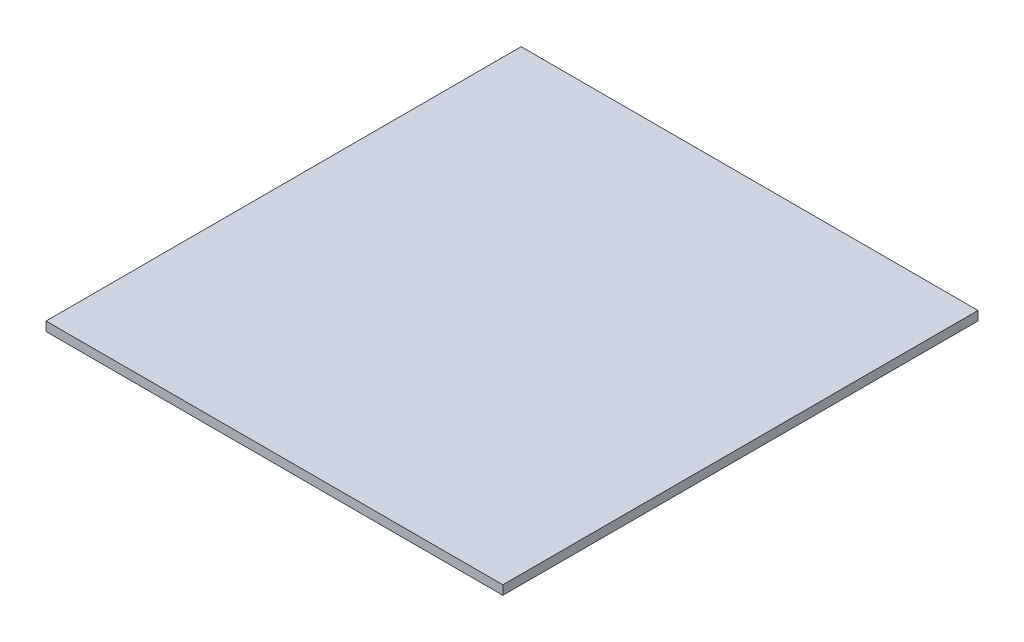
ISO-10303-21;
HEADER;
FILE_DESCRIPTION(('STEP AP214'),'2;1');
FILE_NAME('part.step','',(''),(''),'','','');
FILE_SCHEMA(('AUTOMOTIVE_DESIGN { 1 0 10303 214 1 1 1 1 }'));
ENDSEC;
DATA;
#1=APPLICATION_CONTEXT('core data for automotive mechanical design processes');
#2=APPLICATION_PROTOCOL_DEFINITION('international standard','automotive_design',2000,#1);
#3=PRODUCT_CONTEXT('',#1,'mechanical');
#4=PRODUCT('Part','Part','',(#3));
#5=PRODUCT_RELATED_PRODUCT_CATEGORY('part','',(#4));
#6=PRODUCT_DEFINITION_FORMATION('','',#4);
#7=PRODUCT_DEFINITION_CONTEXT('part definition',#1,'design');
#8=PRODUCT_DEFINITION('design','',#6,#7);
#9=PRODUCT_DEFINITION_SHAPE('','',#8);
#10=(LENGTH_UNIT() NAMED_UNIT(*) SI_UNIT(.MILLI.,.METRE.));
#11=(NAMED_UNIT(*) PLANE_ANGLE_UNIT() SI_UNIT($,.RADIAN.));
#12=(NAMED_UNIT(*) SI_UNIT($,.STERADIAN.) SOLID_ANGLE_UNIT());
#13=UNCERTAINTY_MEASURE_WITH_UNIT(LENGTH_MEASURE(1.E-05),#10,'distance_accuracy_value','');
#14=(GEOMETRIC_REPRESENTATION_CONTEXT(3) GLOBAL_UNCERTAINTY_ASSIGNED_CONTEXT((#13)) GLOBAL_UNIT_ASSIGNED_CONTEXT((#10,
#11,#12)) REPRESENTATION_CONTEXT('',''));
#15=CARTESIAN_POINT('',(0.,0.,0.));
#16=DIRECTION('',(0.,0.,1.));
#17=DIRECTION('',(1.,0.,0.));
#18=AXIS2_PLACEMENT_3D('',#15,#16,#17);
#19=CARTESIAN_POINT('',(100.,4.,104.));
#20=DIRECTION('',(-1.,0.,0.));
#21=DIRECTION('',(0.,0.,1.));
#22=AXIS2_PLACEMENT_3D('',#19,#20,#21);
#23=PLANE('',#22);
#24=DIRECTION('',(0.,0.,-1.));
#25=VECTOR('',#24,1.);
#26=CARTESIAN_POINT('',(100.,0.,104.));
#27=LINE('',#26,#25);
#28=CARTESIAN_POINT('',(100.,0.,104.));
#29=VERTEX_POINT('',#28);
#30=CARTESIAN_POINT('',(100.,0.,-104.));
#31=VERTEX_POINT('',#30);
#32=EDGE_CURVE('E113',#29,#31,#27,.T.);
#33=ORIENTED_EDGE('',*,*,#32,.T.);
#34=DIRECTION('',(0.,-1.,0.));
#35=VECTOR('',#34,1.);
#36=CARTESIAN_POINT('',(100.,4.,-104.));
#37=LINE('',#36,#35);
#38=CARTESIAN_POINT('',(100.,4.,-104.));
#39=VERTEX_POINT('',#38);
#40=EDGE_CURVE('E11',#39,#31,#37,.T.);
#41=ORIENTED_EDGE('',*,*,#40,.F.);
#42=DIRECTION('',(0.,0.,-1.));
#43=VECTOR('',#42,1.);
#44=CARTESIAN_POINT('',(100.,4.,104.));
#45=LINE('',#44,#43);
#46=CARTESIAN_POINT('',(100.,4.,104.));
#47=VERTEX_POINT('',#46);
#48=EDGE_CURVE('E97',#47,#39,#45,.T.);
#49=ORIENTED_EDGE('',*,*,#48,.F.);
#50=DIRECTION('',(0.,-1.,0.));
#51=VECTOR('',#50,1.);
#52=CARTESIAN_POINT('',(100.,4.,104.));
#53=LINE('',#52,#51);
#54=EDGE_CURVE('E109',#47,#29,#53,.T.);
#55=ORIENTED_EDGE('',*,*,#54,.T.);
#56=EDGE_LOOP('',(#33,#41,#49,#55));
#57=FACE_BOUND('',#56,.T.);
#58=ADVANCED_FACE('F45',(#57),#23,.F.);
#59=CARTESIAN_POINT('',(-100.,4.,-104.));
#60=DIRECTION('',(0.,0.,1.));
#61=DIRECTION('',(1.,0.,0.));
#62=AXIS2_PLACEMENT_3D('',#59,#60,#61);
#63=PLANE('',#62);
#64=DIRECTION('',(-1.,0.,0.));
#65=VECTOR('',#64,1.);
#66=CARTESIAN_POINT('',(-100.,0.,-104.));
#67=LINE('',#66,#65);
#68=CARTESIAN_POINT('',(-100.,0.,-104.));
#69=VERTEX_POINT('',#68);
#70=EDGE_CURVE('E102',#31,#69,#67,.T.);
#71=ORIENTED_EDGE('',*,*,#70,.T.);
#72=DIRECTION('',(0.,-1.,0.));
#73=VECTOR('',#72,1.);
#74=CARTESIAN_POINT('',(-100.,4.,-104.));
#75=LINE('',#74,#73);
#76=CARTESIAN_POINT('',(-100.,4.,-104.));
#77=VERTEX_POINT('',#76);
#78=EDGE_CURVE('E54',#77,#69,#75,.T.);
#79=ORIENTED_EDGE('',*,*,#78,.F.);
#80=DIRECTION('',(-1.,0.,0.));
#81=VECTOR('',#80,1.);
#82=CARTESIAN_POINT('',(-100.,4.,-104.));
#83=LINE('',#82,#81);
#84=EDGE_CURVE('E92',#39,#77,#83,.T.);
#85=ORIENTED_EDGE('',*,*,#84,.F.);
#86=ORIENTED_EDGE('',*,*,#40,.T.);
#87=EDGE_LOOP('',(#71,#79,#85,#86));
#88=FACE_BOUND('',#87,.T.);
#89=ADVANCED_FACE('F101',(#88),#63,.F.);
#90=CARTESIAN_POINT('',(-100.,4.,104.));
#91=DIRECTION('',(1.,0.,0.));
#92=DIRECTION('',(0.,0.,-1.));
#93=AXIS2_PLACEMENT_3D('',#90,#91,#92);
#94=PLANE('',#93);
#95=DIRECTION('',(0.,0.,1.));
#96=VECTOR('',#95,1.);
#97=CARTESIAN_POINT('',(-100.,0.,104.));
#98=LINE('',#97,#96);
#99=CARTESIAN_POINT('',(-100.,0.,104.));
#100=VERTEX_POINT('',#99);
#101=EDGE_CURVE('E79',#69,#100,#98,.T.);
#102=ORIENTED_EDGE('',*,*,#101,.T.);
#103=DIRECTION('',(0.,-1.,0.));
#104=VECTOR('',#103,1.);
#105=CARTESIAN_POINT('',(-100.,4.,104.));
#106=LINE('',#105,#104);
#107=CARTESIAN_POINT('',(-100.,4.,104.));
#108=VERTEX_POINT('',#107);
#109=EDGE_CURVE('E104',#108,#100,#106,.T.);
#110=ORIENTED_EDGE('',*,*,#109,.F.);
#111=DIRECTION('',(0.,0.,1.));
#112=VECTOR('',#111,1.);
#113=CARTESIAN_POINT('',(-100.,4.,104.));
#114=LINE('',#113,#112);
#115=EDGE_CURVE('E95',#77,#108,#114,.T.);
#116=ORIENTED_EDGE('',*,*,#115,.F.);
#117=ORIENTED_EDGE('',*,*,#78,.T.);
#118=EDGE_LOOP('',(#102,#110,#116,#117));
#119=FACE_BOUND('',#118,.T.);
#120=ADVANCED_FACE('F105',(#119),#94,.F.);
#121=CARTESIAN_POINT('',(-100.,4.,104.));
#122=DIRECTION('',(0.,0.,-1.));
#123=DIRECTION('',(-1.,0.,0.));
#124=AXIS2_PLACEMENT_3D('',#121,#122,#123);
#125=PLANE('',#124);
#126=DIRECTION('',(1.,0.,0.));
#127=VECTOR('',#126,1.);
#128=CARTESIAN_POINT('',(-100.,0.,104.));
#129=LINE('',#128,#127);
#130=EDGE_CURVE('E85',#100,#29,#129,.T.);
#131=ORIENTED_EDGE('',*,*,#130,.T.);
#132=ORIENTED_EDGE('',*,*,#54,.F.);
#133=DIRECTION('',(1.,0.,0.));
#134=VECTOR('',#133,1.);
#135=CARTESIAN_POINT('',(-100.,4.,104.));
#136=LINE('',#135,#134);
#137=EDGE_CURVE('E62',#108,#47,#136,.T.);
#138=ORIENTED_EDGE('',*,*,#137,.F.);
#139=ORIENTED_EDGE('',*,*,#109,.T.);
#140=EDGE_LOOP('',(#131,#132,#138,#139));
#141=FACE_BOUND('',#140,.T.);
#142=ADVANCED_FACE('F126',(#141),#125,.F.);
#143=CARTESIAN_POINT('',(0.,4.,0.));
#144=DIRECTION('',(0.,-1.,0.));
#145=DIRECTION('',(0.,0.,-1.));
#146=AXIS2_PLACEMENT_3D('',#143,#144,#145);
#147=PLANE('',#146);
#148=ORIENTED_EDGE('',*,*,#48,.T.);
#149=ORIENTED_EDGE('',*,*,#84,.T.);
#150=ORIENTED_EDGE('',*,*,#115,.T.);
#151=ORIENTED_EDGE('',*,*,#137,.T.);
#152=EDGE_LOOP('',(#148,#149,#150,#151));
#153=FACE_BOUND('',#152,.T.);
#154=ADVANCED_FACE('F93',(#153),#147,.F.);
#155=CARTESIAN_POINT('',(0.,0.,0.));
#156=DIRECTION('',(0.,-1.,0.));
#157=DIRECTION('',(0.,0.,-1.));
#158=AXIS2_PLACEMENT_3D('',#155,#156,#157);
#159=PLANE('',#158);
#160=ORIENTED_EDGE('',*,*,#32,.F.);
#161=ORIENTED_EDGE('',*,*,#130,.F.);
#162=ORIENTED_EDGE('',*,*,#101,.F.);
#163=ORIENTED_EDGE('',*,*,#70,.F.);
#164=EDGE_LOOP('',(#160,#161,#162,#163));
#165=FACE_BOUND('',#164,.T.);
#166=ADVANCED_FACE('F129',(#165),#159,.T.);
#167=CLOSED_SHELL('',(#58,#89,#120,#142,#154,#166));
#168=MANIFOLD_SOLID_BREP('B2',#167);
#169=ADVANCED_BREP_SHAPE_REPRESENTATION('',(#18,#168),#14);
#170=SHAPE_DEFINITION_REPRESENTATION(#9,#169);
ENDSEC;
END-ISO-10303-21;
